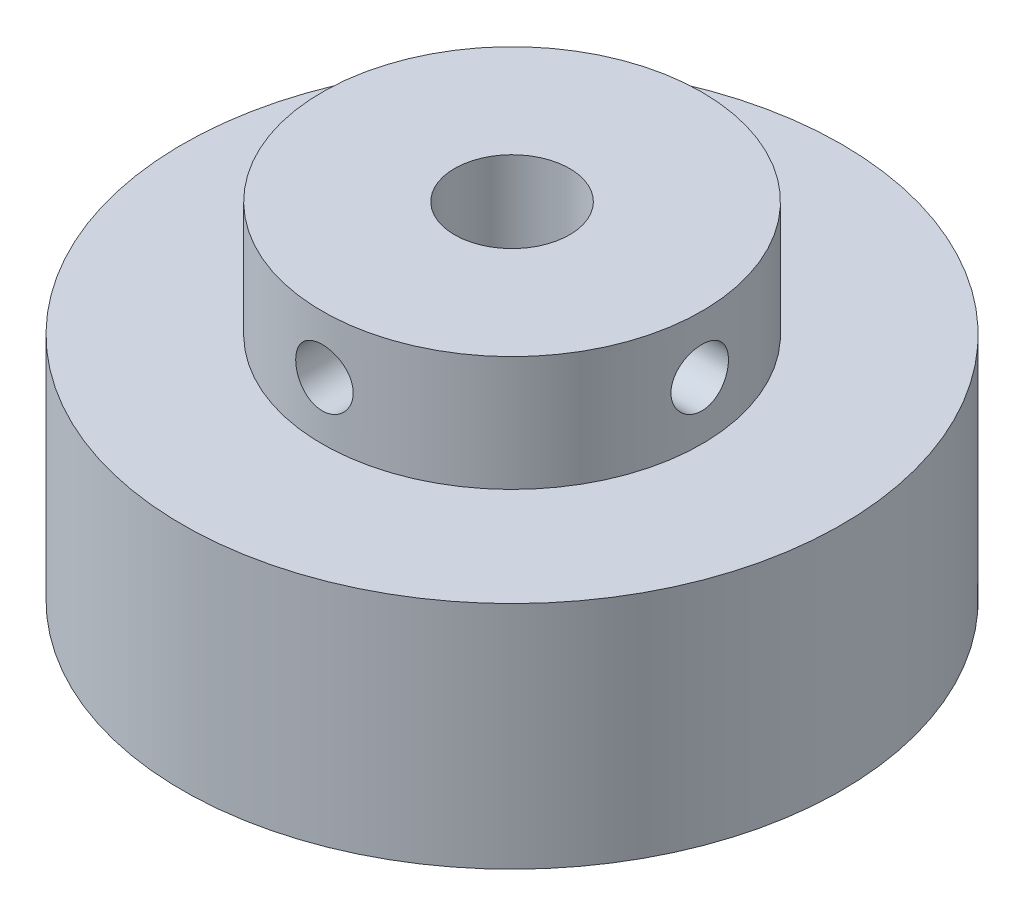
ISO-10303-21;
HEADER;
FILE_DESCRIPTION(('STEP AP214'),'2;1');
FILE_NAME('part.step','',(''),(''),'','','');
FILE_SCHEMA(('AUTOMOTIVE_DESIGN { 1 0 10303 214 1 1 1 1 }'));
ENDSEC;
DATA;
#1=APPLICATION_CONTEXT('core data for automotive mechanical design processes');
#2=APPLICATION_PROTOCOL_DEFINITION('international standard','automotive_design',2000,#1);
#3=PRODUCT_CONTEXT('',#1,'mechanical');
#4=PRODUCT('Part','Part','',(#3));
#5=PRODUCT_RELATED_PRODUCT_CATEGORY('part','',(#4));
#6=PRODUCT_DEFINITION_FORMATION('','',#4);
#7=PRODUCT_DEFINITION_CONTEXT('part definition',#1,'design');
#8=PRODUCT_DEFINITION('design','',#6,#7);
#9=PRODUCT_DEFINITION_SHAPE('','',#8);
#10=(LENGTH_UNIT() NAMED_UNIT(*) SI_UNIT(.MILLI.,.METRE.));
#11=(NAMED_UNIT(*) PLANE_ANGLE_UNIT() SI_UNIT($,.RADIAN.));
#12=(NAMED_UNIT(*) SI_UNIT($,.STERADIAN.) SOLID_ANGLE_UNIT());
#13=UNCERTAINTY_MEASURE_WITH_UNIT(LENGTH_MEASURE(1.E-05),#10,'distance_accuracy_value','');
#14=(GEOMETRIC_REPRESENTATION_CONTEXT(3) GLOBAL_UNCERTAINTY_ASSIGNED_CONTEXT((#13)) GLOBAL_UNIT_ASSIGNED_CONTEXT((#10,
#11,#12)) REPRESENTATION_CONTEXT('',''));
#15=CARTESIAN_POINT('',(0.,0.,0.));
#16=DIRECTION('',(0.,0.,1.));
#17=DIRECTION('',(1.,0.,0.));
#18=AXIS2_PLACEMENT_3D('',#15,#16,#17);
#19=CARTESIAN_POINT('',(-28.65,0.,0.));
#20=DIRECTION('',(0.,1.,0.));
#21=DIRECTION('',(0.,0.,1.));
#22=AXIS2_PLACEMENT_3D('',#19,#20,#21);
#23=PLANE('',#22);
#24=CARTESIAN_POINT('',(0.,0.,0.));
#25=DIRECTION('',(0.,1.,0.));
#26=DIRECTION('',(0.,0.,1.));
#27=AXIS2_PLACEMENT_3D('',#24,#25,#26);
#28=CIRCLE('',#27,5.);
#29=CARTESIAN_POINT('',(0.,0.,5.));
#30=VERTEX_POINT('',#29);
#31=EDGE_CURVE('E93',#30,#30,#28,.T.);
#32=ORIENTED_EDGE('',*,*,#31,.T.);
#33=EDGE_LOOP('',(#32));
#34=FACE_BOUND('',#33,.T.);
#35=CARTESIAN_POINT('',(0.,0.,0.));
#36=DIRECTION('',(0.,-1.,0.));
#37=DIRECTION('',(0.,0.,-1.));
#38=AXIS2_PLACEMENT_3D('',#35,#36,#37);
#39=CIRCLE('',#38,28.65);
#40=CARTESIAN_POINT('',(0.,0.,-28.65));
#41=VERTEX_POINT('',#40);
#42=EDGE_CURVE('E96',#41,#41,#39,.T.);
#43=ORIENTED_EDGE('',*,*,#42,.T.);
#44=EDGE_LOOP('',(#43));
#45=FACE_BOUND('',#44,.T.);
#46=ADVANCED_FACE('F40',(#34,#45),#23,.F.);
#47=CARTESIAN_POINT('',(-4.,30.,0.));
#48=DIRECTION('',(0.,-1.,0.));
#49=DIRECTION('',(0.,0.,-1.));
#50=AXIS2_PLACEMENT_3D('',#47,#48,#49);
#51=PLANE('',#50);
#52=CARTESIAN_POINT('',(0.,30.,0.));
#53=DIRECTION('',(0.,1.,0.));
#54=DIRECTION('',(0.,0.,1.));
#55=AXIS2_PLACEMENT_3D('',#52,#53,#54);
#56=CIRCLE('',#55,5.);
#57=CARTESIAN_POINT('',(0.,30.,5.));
#58=VERTEX_POINT('',#57);
#59=EDGE_CURVE('E88',#58,#58,#56,.T.);
#60=ORIENTED_EDGE('',*,*,#59,.F.);
#61=EDGE_LOOP('',(#60));
#62=FACE_BOUND('',#61,.T.);
#63=CARTESIAN_POINT('',(0.,30.,0.));
#64=DIRECTION('',(0.,-1.,0.));
#65=DIRECTION('',(0.,0.,-1.));
#66=AXIS2_PLACEMENT_3D('',#63,#64,#65);
#67=CIRCLE('',#66,16.5);
#68=CARTESIAN_POINT('',(0.,30.,-16.5));
#69=VERTEX_POINT('',#68);
#70=EDGE_CURVE('E55',#69,#69,#67,.T.);
#71=ORIENTED_EDGE('',*,*,#70,.F.);
#72=EDGE_LOOP('',(#71));
#73=FACE_BOUND('',#72,.T.);
#74=ADVANCED_FACE('F110',(#62,#73),#51,.F.);
#75=CARTESIAN_POINT('',(0.,0.,0.));
#76=DIRECTION('',(0.,-1.,0.));
#77=DIRECTION('',(0.,0.,-1.));
#78=AXIS2_PLACEMENT_3D('',#75,#76,#77);
#79=CYLINDRICAL_SURFACE('',#78,16.5);
#80=CARTESIAN_POINT('',(2.49999999999993,25.,16.3095064303001));
#81=CARTESIAN_POINT('',(2.4999942483855,24.8604413683973,16.3095087812921));
#82=CARTESIAN_POINT('',(2.48827451128461,24.7208021410128,16.3113170969036));
#83=CARTESIAN_POINT('',(2.4417183521953,24.4454290532632,16.3183499305769));
#84=CARTESIAN_POINT('',(2.40685948903224,24.3096991177383,16.3235777649415));
#85=CARTESIAN_POINT('',(2.31509295520606,24.0461703719801,16.3368442337908));
#86=CARTESIAN_POINT('',(2.25820233613405,23.9183655166191,16.3448806940568));
#87=CARTESIAN_POINT('',(2.12402756303371,23.6741334740519,16.3628563282319));
#88=CARTESIAN_POINT('',(2.04674617193598,23.5577047483172,16.37279524431));
#89=CARTESIAN_POINT('',(1.87330966475974,23.3385614918551,16.3935466681487));
#90=CARTESIAN_POINT('',(1.77702082621849,23.2359533336123,16.4043650260533));
#91=CARTESIAN_POINT('',(1.56859147940291,23.0482858693753,16.4256041836637));
#92=CARTESIAN_POINT('',(1.4564500943736,22.9632275346475,16.4360249613402));
#93=CARTESIAN_POINT('',(1.21881679854727,22.8126811424942,16.45535608561));
#94=CARTESIAN_POINT('',(1.09326209693897,22.7472911311862,16.4642587722335));
#95=CARTESIAN_POINT('',(0.832794355157757,22.6385668528332,16.4794858016566));
#96=CARTESIAN_POINT('',(0.697881819736604,22.5952313972381,16.4858102833956));
#97=CARTESIAN_POINT('',(0.423623879475549,22.5321690771746,16.4951270321513));
#98=CARTESIAN_POINT('',(0.284320312574387,22.5122640333693,16.4981444359564));
#99=CARTESIAN_POINT('',(0.00431994439440358,22.4960742390794,16.5005932187305));
#100=CARTESIAN_POINT('',(-0.136376777484987,22.499788150139,16.5000248009035));
#101=CARTESIAN_POINT('',(-0.413953717789495,22.5305903724601,16.495386054184));
#102=CARTESIAN_POINT('',(-0.550855756859762,22.5574869847946,16.4913444460892));
#103=CARTESIAN_POINT('',(-0.818180632405532,22.6335901248947,16.4802454362291));
#104=CARTESIAN_POINT('',(-0.948603299277316,22.6827972363178,16.4731879555668));
#105=CARTESIAN_POINT('',(-1.19984655477983,22.8023203157511,16.4568008630313));
#106=CARTESIAN_POINT('',(-1.32062823554834,22.8727168365252,16.4474626066676));
#107=CARTESIAN_POINT('',(-1.54873674062328,23.0325616059215,16.4275544221171));
#108=CARTESIAN_POINT('',(-1.65606266078575,23.1220111336994,16.416984411256));
#109=CARTESIAN_POINT('',(-1.85534328381537,23.3184902760923,16.3956660412256));
#110=CARTESIAN_POINT('',(-1.94713295502933,23.4256872754556,16.3849169566933));
#111=CARTESIAN_POINT('',(-2.11144641294301,23.6540501483586,16.3645553066737));
#112=CARTESIAN_POINT('',(-2.18397007638783,23.7752161112582,16.3549427484575));
#113=CARTESIAN_POINT('',(-2.30771601876126,24.0282511590832,16.3379426558174));
#114=CARTESIAN_POINT('',(-2.35892108150872,24.1601287920854,16.3305569210232));
#115=CARTESIAN_POINT('',(-2.43840892137461,24.4307491961959,16.3188783708782));
#116=CARTESIAN_POINT('',(-2.46669334847646,24.5694914723773,16.3145853328964));
#117=CARTESIAN_POINT('',(-2.49931016339134,24.8484337480985,16.3096205434828));
#118=CARTESIAN_POINT('',(-2.50387660866082,24.9886057711547,16.3089134067583));
#119=CARTESIAN_POINT('',(-2.48954912848944,25.2677131856797,16.3111065112989));
#120=CARTESIAN_POINT('',(-2.47065594631162,25.4066486161866,16.3140066382762));
#121=CARTESIAN_POINT('',(-2.41014412266082,25.678612262279,16.3230549764189));
#122=CARTESIAN_POINT('',(-2.36864230979681,25.8116670765837,16.3291864843737));
#123=CARTESIAN_POINT('',(-2.26421292456416,26.0689318646334,16.3439929201526));
#124=CARTESIAN_POINT('',(-2.20128427434611,26.1931413930475,16.3526679759235));
#125=CARTESIAN_POINT('',(-2.0552260389381,26.4302383143836,16.3716673108103));
#126=CARTESIAN_POINT('',(-1.97194507355913,26.5430314624194,16.3820037402419));
#127=CARTESIAN_POINT('',(-1.78775645841793,26.7531245397586,16.4031246627207));
#128=CARTESIAN_POINT('',(-1.6868477910421,26.850423573996,16.413909181608));
#129=CARTESIAN_POINT('',(-1.46923687724917,27.0276082649971,16.4348218445733));
#130=CARTESIAN_POINT('',(-1.35240756110129,27.107338722479,16.444943623426));
#131=CARTESIAN_POINT('',(-1.10687753265139,27.2460412089936,16.4632911641627));
#132=CARTESIAN_POINT('',(-0.978177150594648,27.3050138152765,16.4715169787689));
#133=CARTESIAN_POINT('',(-0.713040830285444,27.4002791651763,16.4851178935144));
#134=CARTESIAN_POINT('',(-0.576635835535855,27.4366564491838,16.4905036083175));
#135=CARTESIAN_POINT('',(-0.29956561252379,27.4859720176838,16.4978620836248));
#136=CARTESIAN_POINT('',(-0.158900672246561,27.4989118830366,16.4998350743178));
#137=CARTESIAN_POINT('',(0.12119185317799,27.5009461143803,16.5001434097998));
#138=CARTESIAN_POINT('',(0.260617732680303,27.4902778313523,16.4985149627295));
#139=CARTESIAN_POINT('',(0.535668582489085,27.4459077510867,16.4918764884953));
#140=CARTESIAN_POINT('',(0.671293565686397,27.4122060319774,16.4868664728016));
#141=CARTESIAN_POINT('',(0.934825324139626,27.3228105593447,16.4740252338575));
#142=CARTESIAN_POINT('',(1.06273789683256,27.2671335683902,16.4661961613604));
#143=CARTESIAN_POINT('',(1.30744269380939,27.1353934295853,16.4485762664782));
#144=CARTESIAN_POINT('',(1.42423454217191,27.0593295929158,16.4387853778112));
#145=CARTESIAN_POINT('',(1.64458575443611,26.8881181579702,16.4182130162591));
#146=CARTESIAN_POINT('',(1.74800826113632,26.7927954348337,16.4074229848109));
#147=CARTESIAN_POINT('',(1.93747567299448,26.5861405177175,16.3861313846653));
#148=CARTESIAN_POINT('',(2.02351649521299,26.4748045727391,16.3756298842429));
#149=CARTESIAN_POINT('',(2.17622270772341,26.2385312594144,16.3560396582182));
#150=CARTESIAN_POINT('',(2.24277401618587,26.113519467778,16.346959390353));
#151=CARTESIAN_POINT('',(2.35383523112522,25.8540128678745,16.3313389644563));
#152=CARTESIAN_POINT('',(2.39836793771665,25.7195280344891,16.324796180398));
#153=CARTESIAN_POINT('',(2.45405885885725,25.4870383758629,16.3164978906713));
#154=CARTESIAN_POINT('',(2.471260316395,25.3904671337056,16.313890052321));
#155=CARTESIAN_POINT('',(2.49423282980321,25.1959438271963,16.3103935082494));
#156=CARTESIAN_POINT('',(2.50000403852436,25.0979917813266,16.3095047795395));
#157=CARTESIAN_POINT('',(2.49999999999993,25.,16.3095064303001));
#158=B_SPLINE_CURVE_WITH_KNOTS('',3,(#80,#81,#82,#83,#84,#85,#86,#87,#88,#89,#90,#91,#92,#93,
#94,#95,#96,#97,#98,#99,#100,#101,#102,#103,#104,#105,#106,#107,#108,#109,#110,#111,#112,#113,
#114,#115,#116,#117,#118,#119,#120,#121,#122,#123,#124,#125,#126,#127,#128,#129,#130,#131,#132,
#133,#134,#135,#136,#137,#138,#139,#140,#141,#142,#143,#144,#145,#146,#147,#148,#149,#150,#151,
#152,#153,#154,#155,#156,#157),.UNSPECIFIED.,.T.,.F.,(4,2,2,2,2,2,2,2,2,2,2,2,2,2,2,2,2,2,2,2,2,
2,2,2,2,2,2,2,2,2,2,2,2,2,2,2,2,2,4),(0.,0.418317709291104,0.837041712373869,1.25544228744154,
1.67378619870972,2.09518549623164,2.51660810916115,2.94009795463002,3.36356497523615,
3.78379044831449,4.20399210797082,4.62075207443089,5.03752294423703,5.45589864402397,
5.87430244102237,6.29690429069433,6.71950884391012,7.14245401938006,7.56536874567093,
7.98410195993874,8.40282190796936,8.81939839382169,9.23599583811317,9.65579163948812,
10.0756116828867,10.4990036250491,10.922383792275,11.3441701872149,11.7659281314872,
12.1834650993431,12.6010006509396,13.0182183232422,13.4354500940327,13.856661982995,
14.2779726994341,14.7017024016958,15.124992410952,15.4187201810979,15.7124440233509),.UNSPECIFIED.);
#159=CARTESIAN_POINT('',(2.49999999999993,25.,16.3095064303001));
#160=VERTEX_POINT('',#159);
#161=EDGE_CURVE('E10',#160,#160,#158,.T.);
#162=ORIENTED_EDGE('',*,*,#161,.T.);
#163=EDGE_LOOP('',(#162));
#164=FACE_BOUND('',#163,.T.);
#165=CARTESIAN_POINT('',(16.3095064303001,25.,-2.49999999999999));
#166=CARTESIAN_POINT('',(16.309508781292,24.8604413683973,-2.49999424838556));
#167=CARTESIAN_POINT('',(16.3113170969036,24.7208021410128,-2.48827451128467));
#168=CARTESIAN_POINT('',(16.3183499305768,24.4454290532632,-2.44171835219536));
#169=CARTESIAN_POINT('',(16.3235777649415,24.3096991177383,-2.4068594890323));
#170=CARTESIAN_POINT('',(16.3368442337908,24.0461703719801,-2.31509295520612));
#171=CARTESIAN_POINT('',(16.3448806940568,23.9183655166191,-2.25820233613411));
#172=CARTESIAN_POINT('',(16.3628563282319,23.6741334740518,-2.12402756303376));
#173=CARTESIAN_POINT('',(16.37279524431,23.5577047483172,-2.04674617193604));
#174=CARTESIAN_POINT('',(16.3935466681487,23.3385614918551,-1.8733096647598));
#175=CARTESIAN_POINT('',(16.4043650260533,23.2359533336123,-1.77702082621855));
#176=CARTESIAN_POINT('',(16.4256041836637,23.0482858693753,-1.56859147940296));
#177=CARTESIAN_POINT('',(16.4360249613402,22.9632275346475,-1.45645009437366));
#178=CARTESIAN_POINT('',(16.45535608561,22.8126811424942,-1.21881679854732));
#179=CARTESIAN_POINT('',(16.4642587722335,22.7472911311862,-1.09326209693903));
#180=CARTESIAN_POINT('',(16.4794858016566,22.6385668528332,-0.832794355157814));
#181=CARTESIAN_POINT('',(16.4858102833956,22.5952313972381,-0.697881819736662));
#182=CARTESIAN_POINT('',(16.4951270321513,22.5321690771746,-0.423623879475607));
#183=CARTESIAN_POINT('',(16.4981444359564,22.5122640333693,-0.284320312574445));
#184=CARTESIAN_POINT('',(16.5005932187305,22.4960742390794,-0.0043199443944624));
#185=CARTESIAN_POINT('',(16.5000248009035,22.499788150139,0.136376777484928));
#186=CARTESIAN_POINT('',(16.495386054184,22.5305903724601,0.413953717789436));
#187=CARTESIAN_POINT('',(16.4913444460892,22.5574869847946,0.550855756859704));
#188=CARTESIAN_POINT('',(16.4802454362291,22.6335901248947,0.818180632405475));
#189=CARTESIAN_POINT('',(16.4731879555668,22.6827972363178,0.948603299277259));
#190=CARTESIAN_POINT('',(16.4568008630313,22.8023203157511,1.19984655477977));
#191=CARTESIAN_POINT('',(16.4474626066676,22.8727168365252,1.32062823554828));
#192=CARTESIAN_POINT('',(16.4275544221171,23.0325616059215,1.54873674062322));
#193=CARTESIAN_POINT('',(16.416984411256,23.1220111336994,1.6560626607857));
#194=CARTESIAN_POINT('',(16.3956660412256,23.3184902760923,1.85534328381531));
#195=CARTESIAN_POINT('',(16.3849169566933,23.4256872754556,1.94713295502927));
#196=CARTESIAN_POINT('',(16.3645553066737,23.6540501483586,2.11144641294295));
#197=CARTESIAN_POINT('',(16.3549427484575,23.7752161112582,2.18397007638777));
#198=CARTESIAN_POINT('',(16.3379426558174,24.0282511590832,2.3077160187612));
#199=CARTESIAN_POINT('',(16.3305569210232,24.1601287920854,2.35892108150866));
#200=CARTESIAN_POINT('',(16.3188783708782,24.4307491961959,2.43840892137455));
#201=CARTESIAN_POINT('',(16.3145853328965,24.5694914723773,2.46669334847641));
#202=CARTESIAN_POINT('',(16.3096205434828,24.8484337480985,2.49931016339128));
#203=CARTESIAN_POINT('',(16.3089134067583,24.9886057711547,2.50387660866077));
#204=CARTESIAN_POINT('',(16.3111065112989,25.2677131856797,2.48954912848939));
#205=CARTESIAN_POINT('',(16.3140066382762,25.4066486161866,2.47065594631156));
#206=CARTESIAN_POINT('',(16.3230549764189,25.678612262279,2.41014412266077));
#207=CARTESIAN_POINT('',(16.3291864843737,25.8116670765837,2.36864230979676));
#208=CARTESIAN_POINT('',(16.3439929201526,26.0689318646334,2.2642129245641));
#209=CARTESIAN_POINT('',(16.3526679759235,26.1931413930475,2.20128427434606));
#210=CARTESIAN_POINT('',(16.3716673108103,26.4302383143836,2.05522603893804));
#211=CARTESIAN_POINT('',(16.3820037402419,26.5430314624194,1.97194507355907));
#212=CARTESIAN_POINT('',(16.4031246627207,26.7531245397586,1.78775645841787));
#213=CARTESIAN_POINT('',(16.413909181608,26.850423573996,1.68684779104204));
#214=CARTESIAN_POINT('',(16.4348218445733,27.0276082649971,1.46923687724911));
#215=CARTESIAN_POINT('',(16.444943623426,27.107338722479,1.35240756110123));
#216=CARTESIAN_POINT('',(16.4632911641627,27.2460412089936,1.10687753265133));
#217=CARTESIAN_POINT('',(16.4715169787689,27.3050138152765,0.97817715059459));
#218=CARTESIAN_POINT('',(16.4851178935144,27.4002791651763,0.713040830285386));
#219=CARTESIAN_POINT('',(16.4905036083175,27.4366564491838,0.576635835535797));
#220=CARTESIAN_POINT('',(16.4978620836248,27.4859720176838,0.299565612523733));
#221=CARTESIAN_POINT('',(16.4998350743178,27.4989118830366,0.158900672246504));
#222=CARTESIAN_POINT('',(16.5001434097998,27.5009461143803,-0.121191853178046));
#223=CARTESIAN_POINT('',(16.4985149627295,27.4902778313523,-0.260617732680359));
#224=CARTESIAN_POINT('',(16.4918764884953,27.4459077510867,-0.53566858248914));
#225=CARTESIAN_POINT('',(16.4868664728016,27.4122060319774,-0.671293565686453));
#226=CARTESIAN_POINT('',(16.4740252338575,27.3228105593447,-0.934825324139683));
#227=CARTESIAN_POINT('',(16.4661961613604,27.2671335683902,-1.06273789683262));
#228=CARTESIAN_POINT('',(16.4485762664782,27.1353934295853,-1.30744269380944));
#229=CARTESIAN_POINT('',(16.4387853778111,27.0593295929158,-1.42423454217197));
#230=CARTESIAN_POINT('',(16.4182130162591,26.8881181579702,-1.64458575443616));
#231=CARTESIAN_POINT('',(16.4074229848109,26.7927954348337,-1.74800826113638));
#232=CARTESIAN_POINT('',(16.3861313846653,26.5861405177175,-1.93747567299453));
#233=CARTESIAN_POINT('',(16.3756298842429,26.4748045727391,-2.02351649521304));
#234=CARTESIAN_POINT('',(16.3560396582182,26.2385312594144,-2.17622270772347));
#235=CARTESIAN_POINT('',(16.346959390353,26.113519467778,-2.24277401618592));
#236=CARTESIAN_POINT('',(16.3313389644563,25.8540128678745,-2.35383523112528));
#237=CARTESIAN_POINT('',(16.324796180398,25.7195280344891,-2.3983679377167));
#238=CARTESIAN_POINT('',(16.3164978906713,25.4870383758629,-2.45405885885731));
#239=CARTESIAN_POINT('',(16.313890052321,25.3904671337056,-2.47126031639506));
#240=CARTESIAN_POINT('',(16.3103935082494,25.1959438271963,-2.49423282980327));
#241=CARTESIAN_POINT('',(16.3095047795395,25.0979917813266,-2.50000403852442));
#242=CARTESIAN_POINT('',(16.3095064303001,25.,-2.49999999999999));
#243=B_SPLINE_CURVE_WITH_KNOTS('',3,(#165,#166,#167,#168,#169,#170,#171,#172,#173,#174,#175,
#176,#177,#178,#179,#180,#181,#182,#183,#184,#185,#186,#187,#188,#189,#190,#191,#192,#193,#194,
#195,#196,#197,#198,#199,#200,#201,#202,#203,#204,#205,#206,#207,#208,#209,#210,#211,#212,#213,
#214,#215,#216,#217,#218,#219,#220,#221,#222,#223,#224,#225,#226,#227,#228,#229,#230,#231,#232,
#233,#234,#235,#236,#237,#238,#239,#240,#241,#242),.UNSPECIFIED.,.T.,.F.,(4,2,2,2,2,2,2,2,2,2,2,
2,2,2,2,2,2,2,2,2,2,2,2,2,2,2,2,2,2,2,2,2,2,2,2,2,2,2,4),(0.,0.418317709291104,
0.837041712373869,1.25544228744155,1.67378619870972,2.09518549623164,2.51660810916115,
2.94009795463002,3.36356497523615,3.78379044831449,4.20399210797082,4.6207520744309,
5.03752294423703,5.45589864402397,5.87430244102237,6.29690429069432,6.71950884391012,
7.14245401938005,7.56536874567093,7.98410195993874,8.40282190796936,8.81939839382168,
9.23599583811317,9.65579163948812,10.0756116828867,10.4990036250491,10.922383792275,
11.3441701872149,11.7659281314872,12.1834650993431,12.6010006509396,13.0182183232422,
13.4354500940327,13.856661982995,14.2779726994341,14.7017024016958,15.124992410952,
15.4187201810979,15.7124440233509),.UNSPECIFIED.);
#244=CARTESIAN_POINT('',(16.3095064303001,25.,-2.49999999999999));
#245=VERTEX_POINT('',#244);
#246=EDGE_CURVE('E51',#245,#245,#243,.T.);
#247=ORIENTED_EDGE('',*,*,#246,.T.);
#248=EDGE_LOOP('',(#247));
#249=FACE_BOUND('',#248,.T.);
#250=CARTESIAN_POINT('',(0.,20.,0.));
#251=DIRECTION('',(0.,-1.,0.));
#252=DIRECTION('',(0.,0.,-1.));
#253=AXIS2_PLACEMENT_3D('',#250,#251,#252);
#254=CIRCLE('',#253,16.5);
#255=CARTESIAN_POINT('',(0.,20.,-16.5));
#256=VERTEX_POINT('',#255);
#257=EDGE_CURVE('E59',#256,#256,#254,.T.);
#258=ORIENTED_EDGE('',*,*,#257,.F.);
#259=EDGE_LOOP('',(#258));
#260=FACE_BOUND('',#259,.T.);
#261=ORIENTED_EDGE('',*,*,#70,.T.);
#262=EDGE_LOOP('',(#261));
#263=FACE_BOUND('',#262,.T.);
#264=ADVANCED_FACE('F66',(#164,#249,#260,#263),#79,.T.);
#265=CARTESIAN_POINT('',(-16.5,20.,0.));
#266=DIRECTION('',(0.,-1.,0.));
#267=DIRECTION('',(0.,0.,-1.));
#268=AXIS2_PLACEMENT_3D('',#265,#266,#267);
#269=PLANE('',#268);
#270=CARTESIAN_POINT('',(0.,20.,0.));
#271=DIRECTION('',(0.,-1.,0.));
#272=DIRECTION('',(0.,0.,-1.));
#273=AXIS2_PLACEMENT_3D('',#270,#271,#272);
#274=CIRCLE('',#273,28.65);
#275=CARTESIAN_POINT('',(0.,20.,-28.65));
#276=VERTEX_POINT('',#275);
#277=EDGE_CURVE('E101',#276,#276,#274,.T.);
#278=ORIENTED_EDGE('',*,*,#277,.F.);
#279=EDGE_LOOP('',(#278));
#280=FACE_BOUND('',#279,.T.);
#281=ORIENTED_EDGE('',*,*,#257,.T.);
#282=EDGE_LOOP('',(#281));
#283=FACE_BOUND('',#282,.T.);
#284=ADVANCED_FACE('F106',(#280,#283),#269,.F.);
#285=CARTESIAN_POINT('',(0.,0.,0.));
#286=DIRECTION('',(0.,-1.,0.));
#287=DIRECTION('',(0.,0.,-1.));
#288=AXIS2_PLACEMENT_3D('',#285,#286,#287);
#289=CYLINDRICAL_SURFACE('',#288,28.65);
#290=ORIENTED_EDGE('',*,*,#42,.F.);
#291=EDGE_LOOP('',(#290));
#292=FACE_BOUND('',#291,.T.);
#293=ORIENTED_EDGE('',*,*,#277,.T.);
#294=EDGE_LOOP('',(#293));
#295=FACE_BOUND('',#294,.T.);
#296=ADVANCED_FACE('F122',(#292,#295),#289,.T.);
#297=CARTESIAN_POINT('',(0.,0.,0.));
#298=DIRECTION('',(0.,1.,0.));
#299=DIRECTION('',(0.,0.,1.));
#300=AXIS2_PLACEMENT_3D('',#297,#298,#299);
#301=CYLINDRICAL_SURFACE('',#300,5.);
#302=CARTESIAN_POINT('',(0.,22.5,5.));
#303=CARTESIAN_POINT('',(0.131426682334305,22.500009669056,4.99999177550472));
#304=CARTESIAN_POINT('',(0.263015634437212,22.5104255617741,4.99476199135277));
#305=CARTESIAN_POINT('',(0.522301454622881,22.5516318211621,4.9743541856102));
#306=CARTESIAN_POINT('',(0.649990448564102,22.5824608809251,4.9591572718767));
#307=CARTESIAN_POINT('',(0.897333631316198,22.6629846227189,4.92040690922477));
#308=CARTESIAN_POINT('',(1.01701694536276,22.7126059877828,4.89688595907259));
#309=CARTESIAN_POINT('',(1.2461816039967,22.8289265262518,4.84364443325827));
#310=CARTESIAN_POINT('',(1.35566375203769,22.8956243531451,4.81392434644421));
#311=CARTESIAN_POINT('',(1.56876952630996,23.0487931316427,4.74890645050632));
#312=CARTESIAN_POINT('',(1.67163802294307,23.1362162002298,4.71337997659091));
#313=CARTESIAN_POINT('',(1.8619486170333,23.3263036959854,4.64149925776732));
#314=CARTESIAN_POINT('',(1.94937895911553,23.4289796288402,4.60514440566898));
#315=CARTESIAN_POINT('',(2.11312999967244,23.6562083744453,4.53247377945623));
#316=CARTESIAN_POINT('',(2.18806333849061,23.7818402460351,4.49637967412568));
#317=CARTESIAN_POINT('',(2.31542056761487,24.0459183397955,4.43214946943557));
#318=CARTESIAN_POINT('',(2.36786053751678,24.1843553217627,4.40400769020795));
#319=CARTESIAN_POINT('',(2.44533110537647,24.4616627635965,4.36144667591405));
#320=CARTESIAN_POINT('',(2.47181464267572,24.6000111301797,4.34630678958455));
#321=CARTESIAN_POINT('',(2.50106748329734,24.8799470944377,4.32954724872154));
#322=CARTESIAN_POINT('',(2.50386022093899,25.0215313521752,4.32791423358434));
#323=CARTESIAN_POINT('',(2.48671821792505,25.2857150607909,4.33777325642941));
#324=CARTESIAN_POINT('',(2.46946139884047,25.4085600780583,4.34771909154989));
#325=CARTESIAN_POINT('',(2.41734962264375,25.649304773432,4.3769057183468));
#326=CARTESIAN_POINT('',(2.38248905974445,25.7672028632632,4.39614947079459));
#327=CARTESIAN_POINT('',(2.2955244509645,25.9980728314144,4.44218691031844));
#328=CARTESIAN_POINT('',(2.24303766778978,26.1108659969646,4.46914601659997));
#329=CARTESIAN_POINT('',(2.12260421917002,26.326585731475,4.52758510703518));
#330=CARTESIAN_POINT('',(2.05465060953109,26.4295078390003,4.55906711950482));
#331=CARTESIAN_POINT('',(1.89516513728182,26.6363031318581,4.62782894758218));
#332=CARTESIAN_POINT('',(1.80173614592308,26.7386421839404,4.66533775591869));
#333=CARTESIAN_POINT('',(1.59888894685332,26.9268385464773,4.73869058251023));
#334=CARTESIAN_POINT('',(1.48946314143559,27.0126879800847,4.77453379897007));
#335=CARTESIAN_POINT('',(1.25129126457949,27.1692141525744,4.84254968207412));
#336=CARTESIAN_POINT('',(1.12188397899839,27.2390011811144,4.87447460405018));
#337=CARTESIAN_POINT('',(0.851165538721849,27.3552425726075,4.92894702803111));
#338=CARTESIAN_POINT('',(0.709863940663026,27.4017154625379,4.95150197358895));
#339=CARTESIAN_POINT('',(0.431916229151646,27.4661885092917,4.9831083435358));
#340=CARTESIAN_POINT('',(0.295853826370774,27.486228089367,4.99312345753241));
#341=CARTESIAN_POINT('',(0.0219489998731613,27.5036618278362,5.00182533647794));
#342=CARTESIAN_POINT('',(-0.115892549675233,27.5010667140985,5.00051746803426));
#343=CARTESIAN_POINT('',(-0.378082429964775,27.4744832789533,4.98727980633467));
#344=CARTESIAN_POINT('',(-0.502648520123824,27.4521686681756,4.97618114219991));
#345=CARTESIAN_POINT('',(-0.746017230756085,27.3894048202616,4.94555428287527));
#346=CARTESIAN_POINT('',(-0.864819214231994,27.3489535838641,4.92602515837623));
#347=CARTESIAN_POINT('',(-1.09722152111975,27.2500038339196,4.87960628532326));
#348=CARTESIAN_POINT('',(-1.21057599249841,27.1910223747176,4.85252204417871));
#349=CARTESIAN_POINT('',(-1.42615340426449,27.0572311608751,4.79359935799747));
#350=CARTESIAN_POINT('',(-1.52837157450214,26.9824146634801,4.76175888940531));
#351=CARTESIAN_POINT('',(-1.72941922315497,26.8105989367091,4.69270553315083));
#352=CARTESIAN_POINT('',(-1.82693019428505,26.7121428290247,4.65527212009484));
#353=CARTESIAN_POINT('',(-2.00464080257229,26.5001871219505,4.58155978921583));
#354=CARTESIAN_POINT('',(-2.08482846428694,26.3866772029301,4.54528168472403));
#355=CARTESIAN_POINT('',(-2.22926978619003,26.1408908645153,4.47627980545276));
#356=CARTESIAN_POINT('',(-2.29256373922251,26.0079718347088,4.4438132398125));
#357=CARTESIAN_POINT('',(-2.39520706511466,25.7312248311174,4.38935180726742));
#358=CARTESIAN_POINT('',(-2.43458729077062,25.5874111839999,4.3673434554901));
#359=CARTESIAN_POINT('',(-2.48465421767011,25.307724442637,4.33903752569348));
#360=CARTESIAN_POINT('',(-2.49773248744365,25.172414365881,4.33143458674093));
#361=CARTESIAN_POINT('',(-2.50172288950903,24.9013823326193,4.32913386592576));
#362=CARTESIAN_POINT('',(-2.4926446298327,24.7656605801263,4.33443049025108));
#363=CARTESIAN_POINT('',(-2.45481530197335,24.5112912443831,4.35594655164661));
#364=CARTESIAN_POINT('',(-2.42802074302699,24.3922488182792,4.37107736338131));
#365=CARTESIAN_POINT('',(-2.35793843840546,24.1604797078,4.40927540337601));
#366=CARTESIAN_POINT('',(-2.31464538728735,24.0477550684334,4.43234518434964));
#367=CARTESIAN_POINT('',(-2.2095391931554,23.8234378472802,4.48571326433412));
#368=CARTESIAN_POINT('',(-2.14667719009405,23.7124301482649,4.51639307998449));
#369=CARTESIAN_POINT('',(-2.00537808387991,23.5018137567599,4.58088327077455));
#370=CARTESIAN_POINT('',(-1.92693287765889,23.4022110373712,4.61469526970766));
#371=CARTESIAN_POINT('',(-1.74550556946066,23.2046446362503,4.6865581632701));
#372=CARTESIAN_POINT('',(-1.6407002246921,23.1083506358286,4.7246249151498));
#373=CARTESIAN_POINT('',(-1.41539785420683,22.9343441505719,4.79694347383545));
#374=CARTESIAN_POINT('',(-1.29489242426332,22.8566416813941,4.83119321905446));
#375=CARTESIAN_POINT('',(-1.03978808878535,22.7219030205159,4.89245149457782));
#376=CARTESIAN_POINT('',(-0.905095560782278,22.6650168322155,4.91940711437489));
#377=CARTESIAN_POINT('',(-0.696328709257342,22.5978161412076,4.95177960923351));
#378=CARTESIAN_POINT('',(-0.625670413494079,22.5784446019982,4.96122314081874));
#379=CARTESIAN_POINT('',(-0.482623997839248,22.5459340516294,4.97717127275101));
#380=CARTESIAN_POINT('',(-0.410236963092391,22.5327912333237,4.98367766823159));
#381=CARTESIAN_POINT('',(-0.281518684621662,22.5152625277154,4.9923820076613));
#382=CARTESIAN_POINT('',(-0.225408499555436,22.5095450634687,4.99523288466454));
#383=CARTESIAN_POINT('',(-0.112875528456284,22.5019116705343,4.99904367329659));
#384=CARTESIAN_POINT('',(-0.0564527338382155,22.4999958467745,5.00000353273198));
#385=CARTESIAN_POINT('',(0.,22.5,5.));
#386=B_SPLINE_CURVE_WITH_KNOTS('',3,(#302,#303,#304,#305,#306,#307,#308,#309,#310,#311,#312,
#313,#314,#315,#316,#317,#318,#319,#320,#321,#322,#323,#324,#325,#326,#327,#328,#329,#330,#331,
#332,#333,#334,#335,#336,#337,#338,#339,#340,#341,#342,#343,#344,#345,#346,#347,#348,#349,#350,
#351,#352,#353,#354,#355,#356,#357,#358,#359,#360,#361,#362,#363,#364,#365,#366,#367,#368,#369,
#370,#371,#372,#373,#374,#375,#376,#377,#378,#379,#380,#381,#382,#383,#384,#385),.UNSPECIFIED.,
.T.,.F.,(4,2,2,2,2,2,2,2,2,2,2,2,2,2,2,2,2,2,2,2,2,2,2,2,2,2,2,2,2,2,2,2,2,2,2,2,2,2,2,2,2,4),
(0.,0.394060643550731,0.788870374272993,1.18215538873074,1.57540940145392,1.99245439679522,
2.40981559413508,2.85954316076881,3.30894869745701,3.73145030350572,4.15353393322548,
4.52514281023299,4.89687009814193,5.27725600421216,5.65781303150552,6.08662353334694,
6.51563836496714,6.96457555536099,7.41315542280696,7.8245822617836,8.23581411278685,
8.615172662653,8.99457304077324,9.38482140069741,9.77523626870843,10.2039902661036,
10.6330397153794,11.0828670540368,11.5321127986299,11.9382326875698,12.3441764966106,
12.711448256215,13.0788382197024,13.4709114195008,13.8631890285844,14.3031310689229,
14.7433095845248,15.1866003415818,15.4079349392079,15.6291340766843,15.7983933645034,
15.9676573239322),.UNSPECIFIED.);
#387=CARTESIAN_POINT('',(0.,22.5,5.));
#388=VERTEX_POINT('',#387);
#389=EDGE_CURVE('E89',#388,#388,#386,.T.);
#390=ORIENTED_EDGE('',*,*,#389,.T.);
#391=EDGE_LOOP('',(#390));
#392=FACE_BOUND('',#391,.T.);
#393=CARTESIAN_POINT('',(4.3301270189222,25.,-2.49999999999999));
#394=CARTESIAN_POINT('',(4.33013982272992,25.1302665068765,-2.49998948436431));
#395=CARTESIAN_POINT('',(4.33609541965584,25.2607027206762,-2.48974954513167));
#396=CARTESIAN_POINT('',(4.35905877051908,25.5175689715292,-2.44930840724942));
#397=CARTESIAN_POINT('',(4.37608974726023,25.6439900040573,-2.41906526369544));
#398=CARTESIAN_POINT('',(4.41873376871659,25.8886289455611,-2.34024976997569));
#399=CARTESIAN_POINT('',(4.44430111338922,26.0068865735622,-2.29177485369962));
#400=CARTESIAN_POINT('',(4.50106659111456,26.2335605630945,-2.17816884056413));
#401=CARTESIAN_POINT('',(4.53226502875884,26.3419763917958,-2.1130368426267));
#402=CARTESIAN_POINT('',(4.59992173524851,26.5557643039169,-1.96166634317252));
#403=CARTESIAN_POINT('',(4.63660159331578,26.6601478344898,-1.87413008816916));
#404=CARTESIAN_POINT('',(4.70929956727453,26.8535209757132,-1.68313452122751));
#405=CARTESIAN_POINT('',(4.74531734512768,26.9425029077549,-1.5796673150605));
#406=CARTESIAN_POINT('',(4.81553692452135,27.1084178764856,-1.35122390789081));
#407=CARTESIAN_POINT('',(4.84945266064072,27.1841344192791,-1.22526797235893));
#408=CARTESIAN_POINT('',(4.90876890230193,27.3128521334839,-0.960392566671141));
#409=CARTESIAN_POINT('',(4.93417477954535,27.3658676404385,-0.821481345389979));
#410=CARTESIAN_POINT('',(4.9720115311507,27.443761653164,-0.545112359773521));
#411=CARTESIAN_POINT('',(4.98523700553425,27.4703738158651,-0.408254476210981));
#412=CARTESIAN_POINT('',(5.00018959613973,27.5004152967113,-0.131426571755676));
#413=CARTESIAN_POINT('',(5.00192366961168,27.5038586419954,0.00854151460650873));
#414=CARTESIAN_POINT('',(4.99407454791405,27.4881333150686,0.274581311061964));
#415=CARTESIAN_POINT('',(4.98546239730476,27.4709049611954,0.400802997942671));
#416=CARTESIAN_POINT('',(4.95935613149294,27.4177978902398,0.648284429795108));
#417=CARTESIAN_POINT('',(4.94186135165964,27.3819177775598,0.769543802734623));
#418=CARTESIAN_POINT('',(4.89928958219157,27.2922935847751,1.00577347892407));
#419=CARTESIAN_POINT('',(4.87411103823003,27.2383092170697,1.12063355878799));
#420=CARTESIAN_POINT('',(4.81844114966712,27.1143414594964,1.33994200378327));
#421=CARTESIAN_POINT('',(4.78794790393709,27.0443523417442,1.44438662209659));
#422=CARTESIAN_POINT('',(4.72110985998075,26.8827616211674,1.6504341522455));
#423=CARTESIAN_POINT('',(4.68448439995438,26.789742429185,1.7508351875734));
#424=CARTESIAN_POINT('',(4.61135851467029,26.5885256876746,1.93526092574444));
#425=CARTESIAN_POINT('',(4.57485820664072,26.4803165693148,2.01927302893557));
#426=CARTESIAN_POINT('',(4.50360390231212,26.2433795189398,2.17376333660552));
#427=CARTESIAN_POINT('',(4.46910799976769,26.1137849423645,2.24304328744512));
#428=CARTESIAN_POINT('',(4.4093862569644,25.8426558216025,2.35829778250307));
#429=CARTESIAN_POINT('',(4.38415075115169,25.7011339174561,2.40429664552721));
#430=CARTESIAN_POINT('',(4.34861589542587,25.421963721793,2.46795052756259));
#431=CARTESIAN_POINT('',(4.33729139621242,25.2848972023911,2.48756280529993));
#432=CARTESIAN_POINT('',(4.32794798404024,25.0089966462086,2.50379236652856));
#433=CARTESIAN_POINT('',(4.3299196722328,24.8701639272005,2.50042589328756));
#434=CARTESIAN_POINT('',(4.34585841351463,24.6108652035532,2.4725901083599));
#435=CARTESIAN_POINT('',(4.35848968766636,24.4900513722303,2.45046954178114));
#436=CARTESIAN_POINT('',(4.39235053878353,24.2540805343225,2.3892407115811));
#437=CARTESIAN_POINT('',(4.41358290012585,24.1389253731332,2.35012694655907));
#438=CARTESIAN_POINT('',(4.46340555199142,23.9114716727436,2.25411897151215));
#439=CARTESIAN_POINT('',(4.49229108107658,23.7995524578674,2.19648515923161));
#440=CARTESIAN_POINT('',(4.55390298743126,23.5863268211512,2.06571766003968));
#441=CARTESIAN_POINT('',(4.58663133387873,23.4850258912119,1.99257601083122));
#442=CARTESIAN_POINT('',(4.65719996140837,23.2825530811967,1.82209291799634));
#443=CARTESIAN_POINT('',(4.69516457885708,23.1830071232278,1.72286318078433));
#444=CARTESIAN_POINT('',(4.76835587444747,23.0014694049941,1.50851123849878));
#445=CARTESIAN_POINT('',(4.80358162519329,22.9194835743415,1.39338368664987));
#446=CARTESIAN_POINT('',(4.86853404227335,22.7735656852091,1.14633840638506));
#447=CARTESIAN_POINT('',(4.89809104179855,22.7101672047916,1.01405774389061));
#448=CARTESIAN_POINT('',(4.9470838739847,22.607155240038,0.738805911647324));
#449=CARTESIAN_POINT('',(4.96652859191746,22.5675208703949,0.59584425364706));
#450=CARTESIAN_POINT('',(4.99168770453968,22.5165785906436,0.317449205674699));
#451=CARTESIAN_POINT('',(4.99849819767838,22.5030053141697,0.18252860908537));
#452=CARTESIAN_POINT('',(5.00105325940467,22.4978918325054,-0.0878149643374356));
#453=CARTESIAN_POINT('',(4.99680170177041,22.5063439143389,-0.223237748727021));
#454=CARTESIAN_POINT('',(4.97834922085637,22.5435410303955,-0.481344982671076));
#455=CARTESIAN_POINT('',(4.96482236636807,22.5709121716363,-0.604280801321776));
#456=CARTESIAN_POINT('',(4.92980234191731,22.6433174497584,-0.843614873664457));
#457=CARTESIAN_POINT('',(4.90830802955518,22.6883541196337,-0.960012187087214));
#458=CARTESIAN_POINT('',(4.85814826741488,22.7968178187393,-1.18855854199593));
#459=CARTESIAN_POINT('',(4.82921542506803,22.8609490246899,-1.30031295715363));
#460=CARTESIAN_POINT('',(4.76720333344986,23.0048941101476,-1.51193650408535));
#461=CARTESIAN_POINT('',(4.73412218229105,23.0847151926269,-1.61180014305397));
#462=CARTESIAN_POINT('',(4.66321523550925,23.2669957944494,-1.80728542324369));
#463=CARTESIAN_POINT('',(4.62524489658367,23.3709177260007,-1.90149582349002));
#464=CARTESIAN_POINT('',(4.55157698284941,23.5936152853822,-2.07165660492503));
#465=CARTESIAN_POINT('',(4.51588143910585,23.7124039141992,-2.14759083151539));
#466=CARTESIAN_POINT('',(4.44998982823926,23.9666361176643,-2.28108393396028));
#467=CARTESIAN_POINT('',(4.42000320346984,24.1024873884246,-2.33798627977449));
#468=CARTESIAN_POINT('',(4.38370272660094,24.3132226495198,-2.40494911880458));
#469=CARTESIAN_POINT('',(4.37305486646055,24.3845597756976,-2.4241958268399));
#470=CARTESIAN_POINT('',(4.35507574170935,24.5290406968493,-2.45635087255788));
#471=CARTESIAN_POINT('',(4.34774215854234,24.6021831909544,-2.46926364179175));
#472=CARTESIAN_POINT('',(4.33823779542921,24.7295009865469,-2.48591166201422));
#473=CARTESIAN_POINT('',(4.33520487024792,24.7834163215122,-2.49118864979201));
#474=CARTESIAN_POINT('',(4.33114674911323,24.8915446163104,-2.49823512543932));
#475=CARTESIAN_POINT('',(4.33012168747262,24.9457575958106,-2.50000437866473));
#476=CARTESIAN_POINT('',(4.3301270189222,25.,-2.49999999999999));
#477=B_SPLINE_CURVE_WITH_KNOTS('',3,(#393,#394,#395,#396,#397,#398,#399,#400,#401,#402,#403,
#404,#405,#406,#407,#408,#409,#410,#411,#412,#413,#414,#415,#416,#417,#418,#419,#420,#421,#422,
#423,#424,#425,#426,#427,#428,#429,#430,#431,#432,#433,#434,#435,#436,#437,#438,#439,#440,#441,
#442,#443,#444,#445,#446,#447,#448,#449,#450,#451,#452,#453,#454,#455,#456,#457,#458,#459,#460,
#461,#462,#463,#464,#465,#466,#467,#468,#469,#470,#471,#472,#473,#474,#475,#476),.UNSPECIFIED.,
.T.,.F.,(4,2,2,2,2,2,2,2,2,2,2,2,2,2,2,2,2,2,2,2,2,2,2,2,2,2,2,2,2,2,2,2,2,2,2,2,2,2,2,2,2,4),
(0.,0.390580306486785,0.781982232062008,1.17132148982691,1.5606818136637,1.98215578129641,
2.4038392771601,2.85394730601991,3.30377067414809,3.72158712424919,4.13915059220181,
4.52040243716427,4.90168281298719,5.28823836832948,5.6749324838076,6.09817978647307,
6.52175120619877,6.97222104328701,7.42221935534342,7.83655727140609,8.25060232976012,
8.61935458565143,8.98822631095237,9.37418241020298,9.76033715555197,10.1951685895661,
10.6301466245058,11.0766045353749,11.5226694952701,11.9278067597879,12.3328021699001,
12.7111106218381,13.0894733378511,13.4840187680376,13.8787457525687,14.3127560463024,
14.7471485711796,15.1952687260159,15.4189244153949,15.6424233996906,15.8050484542805,
15.9676843870378),.UNSPECIFIED.);
#478=CARTESIAN_POINT('',(4.3301270189222,25.,-2.49999999999999));
#479=VERTEX_POINT('',#478);
#480=EDGE_CURVE('E81',#479,#479,#477,.T.);
#481=ORIENTED_EDGE('',*,*,#480,.T.);
#482=EDGE_LOOP('',(#481));
#483=FACE_BOUND('',#482,.T.);
#484=ORIENTED_EDGE('',*,*,#31,.F.);
#485=EDGE_LOOP('',(#484));
#486=FACE_BOUND('',#485,.T.);
#487=ORIENTED_EDGE('',*,*,#59,.T.);
#488=EDGE_LOOP('',(#487));
#489=FACE_BOUND('',#488,.T.);
#490=ADVANCED_FACE('F74',(#392,#483,#486,#489),#301,.F.);
#491=CARTESIAN_POINT('',(16.5,25.,0.));
#492=DIRECTION('',(1.,0.,0.));
#493=DIRECTION('',(0.,0.,-1.));
#494=AXIS2_PLACEMENT_3D('',#491,#492,#493);
#495=CYLINDRICAL_SURFACE('',#494,2.49999999999999);
#496=ORIENTED_EDGE('',*,*,#246,.F.);
#497=EDGE_LOOP('',(#496));
#498=FACE_BOUND('',#497,.T.);
#499=ORIENTED_EDGE('',*,*,#480,.F.);
#500=EDGE_LOOP('',(#499));
#501=FACE_BOUND('',#500,.T.);
#502=ADVANCED_FACE('F69',(#498,#501),#495,.F.);
#503=CARTESIAN_POINT('',(0.,25.,16.5));
#504=DIRECTION('',(0.,0.,1.));
#505=DIRECTION('',(1.,0.,0.));
#506=AXIS2_PLACEMENT_3D('',#503,#504,#505);
#507=CYLINDRICAL_SURFACE('',#506,2.49999999999999);
#508=ORIENTED_EDGE('',*,*,#161,.F.);
#509=EDGE_LOOP('',(#508));
#510=FACE_BOUND('',#509,.T.);
#511=ORIENTED_EDGE('',*,*,#389,.F.);
#512=EDGE_LOOP('',(#511));
#513=FACE_BOUND('',#512,.T.);
#514=ADVANCED_FACE('F73',(#510,#513),#507,.F.);
#515=CLOSED_SHELL('',(#46,#74,#264,#284,#296,#490,#502,#514));
#516=MANIFOLD_SOLID_BREP('B2',#515);
#517=ADVANCED_BREP_SHAPE_REPRESENTATION('',(#18,#516),#14);
#518=SHAPE_DEFINITION_REPRESENTATION(#9,#517);
ENDSEC;
END-ISO-10303-21;
